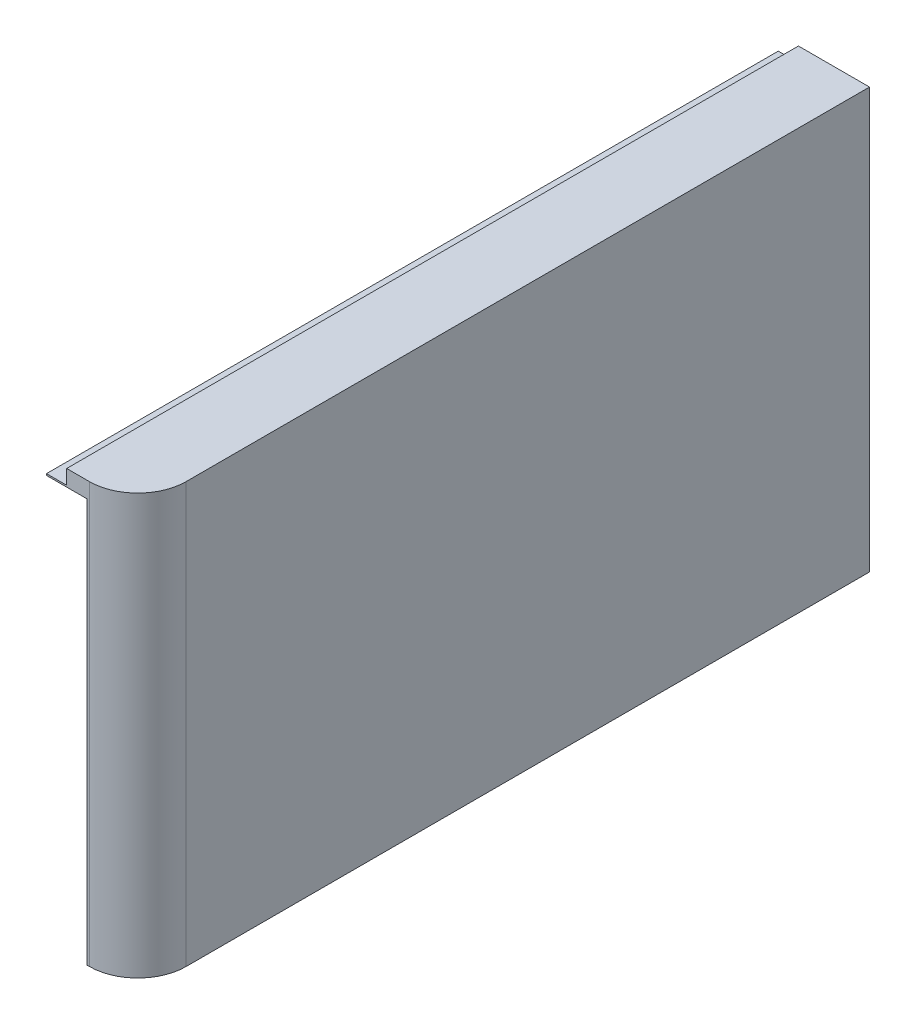
ISO-10303-21;
HEADER;
FILE_DESCRIPTION(('STEP AP214'),'2;1');
FILE_NAME('part.step','',(''),(''),'','','');
FILE_SCHEMA(('AUTOMOTIVE_DESIGN { 1 0 10303 214 1 1 1 1 }'));
ENDSEC;
DATA;
#1=APPLICATION_CONTEXT('core data for automotive mechanical design processes');
#2=APPLICATION_PROTOCOL_DEFINITION('international standard','automotive_design',2000,#1);
#3=PRODUCT_CONTEXT('',#1,'mechanical');
#4=PRODUCT('Part','Part','',(#3));
#5=PRODUCT_RELATED_PRODUCT_CATEGORY('part','',(#4));
#6=PRODUCT_DEFINITION_FORMATION('','',#4);
#7=PRODUCT_DEFINITION_CONTEXT('part definition',#1,'design');
#8=PRODUCT_DEFINITION('design','',#6,#7);
#9=PRODUCT_DEFINITION_SHAPE('','',#8);
#10=(LENGTH_UNIT() NAMED_UNIT(*) SI_UNIT(.MILLI.,.METRE.));
#11=(NAMED_UNIT(*) PLANE_ANGLE_UNIT() SI_UNIT($,.RADIAN.));
#12=(NAMED_UNIT(*) SI_UNIT($,.STERADIAN.) SOLID_ANGLE_UNIT());
#13=UNCERTAINTY_MEASURE_WITH_UNIT(LENGTH_MEASURE(1.E-05),#10,'distance_accuracy_value','');
#14=(GEOMETRIC_REPRESENTATION_CONTEXT(3) GLOBAL_UNCERTAINTY_ASSIGNED_CONTEXT((#13)) GLOBAL_UNIT_ASSIGNED_CONTEXT((#10,
#11,#12)) REPRESENTATION_CONTEXT('',''));
#15=CARTESIAN_POINT('',(0.,0.,0.));
#16=DIRECTION('',(0.,0.,1.));
#17=DIRECTION('',(1.,0.,0.));
#18=AXIS2_PLACEMENT_3D('',#15,#16,#17);
#19=CARTESIAN_POINT('',(664.,576.,1557.));
#20=DIRECTION('',(0.,1.,0.));
#21=DIRECTION('',(0.,0.,1.));
#22=AXIS2_PLACEMENT_3D('',#19,#20,#21);
#23=PLANE('',#22);
#24=DIRECTION('',(0.,0.,1.));
#25=VECTOR('',#24,1.);
#26=CARTESIAN_POINT('',(664.,576.,1104.));
#27=LINE('',#26,#25);
#28=CARTESIAN_POINT('',(664.,576.,1104.));
#29=VERTEX_POINT('',#28);
#30=CARTESIAN_POINT('',(664.,576.,2010.));
#31=VERTEX_POINT('',#30);
#32=EDGE_CURVE('E106',#29,#31,#27,.T.);
#33=ORIENTED_EDGE('',*,*,#32,.F.);
#34=DIRECTION('',(-1.,0.,0.));
#35=VECTOR('',#34,1.);
#36=CARTESIAN_POINT('',(727.,576.,1104.));
#37=LINE('',#36,#35);
#38=CARTESIAN_POINT('',(727.,576.,1104.));
#39=VERTEX_POINT('',#38);
#40=EDGE_CURVE('E36',#39,#29,#37,.T.);
#41=ORIENTED_EDGE('',*,*,#40,.F.);
#42=DIRECTION('',(0.,0.,-1.));
#43=VECTOR('',#42,1.);
#44=CARTESIAN_POINT('',(727.,576.,1950.));
#45=LINE('',#44,#43);
#46=CARTESIAN_POINT('',(727.,576.,1950.));
#47=VERTEX_POINT('',#46);
#48=EDGE_CURVE('E109',#47,#39,#45,.T.);
#49=ORIENTED_EDGE('',*,*,#48,.F.);
#50=CARTESIAN_POINT('',(667.,576.,1950.));
#51=DIRECTION('',(0.,1.,0.));
#52=DIRECTION('',(0.,0.,1.));
#53=AXIS2_PLACEMENT_3D('',#50,#51,#52);
#54=CIRCLE('',#53,60.);
#55=CARTESIAN_POINT('',(667.,576.,2010.));
#56=VERTEX_POINT('',#55);
#57=EDGE_CURVE('E125',#56,#47,#54,.T.);
#58=ORIENTED_EDGE('',*,*,#57,.F.);
#59=DIRECTION('',(1.,0.,0.));
#60=VECTOR('',#59,1.);
#61=CARTESIAN_POINT('',(664.,576.,2010.));
#62=LINE('',#61,#60);
#63=EDGE_CURVE('E11',#31,#56,#62,.T.);
#64=ORIENTED_EDGE('',*,*,#63,.F.);
#65=EDGE_LOOP('',(#33,#41,#49,#58,#64));
#66=FACE_BOUND('',#65,.T.);
#67=ADVANCED_FACE('F17',(#66),#23,.F.);
#68=CARTESIAN_POINT('',(664.,576.,2010.));
#69=DIRECTION('',(0.,0.,1.));
#70=DIRECTION('',(0.,1.,0.));
#71=AXIS2_PLACEMENT_3D('',#68,#69,#70);
#72=PLANE('',#71);
#73=ORIENTED_EDGE('',*,*,#63,.T.);
#74=DIRECTION('',(0.,1.,0.));
#75=VECTOR('',#74,1.);
#76=CARTESIAN_POINT('',(667.,576.,2010.));
#77=LINE('',#76,#75);
#78=CARTESIAN_POINT('',(667.,1096.,2010.));
#79=VERTEX_POINT('',#78);
#80=EDGE_CURVE('E27',#56,#79,#77,.T.);
#81=ORIENTED_EDGE('',*,*,#80,.T.);
#82=DIRECTION('',(-1.,0.,0.));
#83=VECTOR('',#82,1.);
#84=CARTESIAN_POINT('',(667.,1096.,2010.));
#85=LINE('',#84,#83);
#86=CARTESIAN_POINT('',(639.,1096.,2010.));
#87=VERTEX_POINT('',#86);
#88=EDGE_CURVE('E108',#79,#87,#85,.T.);
#89=ORIENTED_EDGE('',*,*,#88,.T.);
#90=DIRECTION('',(0.,1.,0.));
#91=VECTOR('',#90,1.);
#92=CARTESIAN_POINT('',(639.,1078.,2010.));
#93=LINE('',#92,#91);
#94=CARTESIAN_POINT('',(639.,1078.,2010.));
#95=VERTEX_POINT('',#94);
#96=EDGE_CURVE('E104',#95,#87,#93,.T.);
#97=ORIENTED_EDGE('',*,*,#96,.F.);
#98=DIRECTION('',(1.,0.,0.));
#99=VECTOR('',#98,1.);
#100=CARTESIAN_POINT('',(614.,1078.,2010.));
#101=LINE('',#100,#99);
#102=CARTESIAN_POINT('',(614.,1078.,2010.));
#103=VERTEX_POINT('',#102);
#104=EDGE_CURVE('E105',#103,#95,#101,.T.);
#105=ORIENTED_EDGE('',*,*,#104,.F.);
#106=DIRECTION('',(0.,1.,0.));
#107=VECTOR('',#106,1.);
#108=CARTESIAN_POINT('',(614.,1076.,2010.));
#109=LINE('',#108,#107);
#110=CARTESIAN_POINT('',(614.,1076.,2010.));
#111=VERTEX_POINT('',#110);
#112=EDGE_CURVE('E130',#111,#103,#109,.T.);
#113=ORIENTED_EDGE('',*,*,#112,.F.);
#114=DIRECTION('',(-1.,0.,0.));
#115=VECTOR('',#114,1.);
#116=CARTESIAN_POINT('',(664.,1076.,2010.));
#117=LINE('',#116,#115);
#118=CARTESIAN_POINT('',(664.,1076.,2010.));
#119=VERTEX_POINT('',#118);
#120=EDGE_CURVE('E85',#119,#111,#117,.T.);
#121=ORIENTED_EDGE('',*,*,#120,.F.);
#122=DIRECTION('',(0.,1.,0.));
#123=VECTOR('',#122,1.);
#124=CARTESIAN_POINT('',(664.,576.,2010.));
#125=LINE('',#124,#123);
#126=EDGE_CURVE('E82',#31,#119,#125,.T.);
#127=ORIENTED_EDGE('',*,*,#126,.F.);
#128=EDGE_LOOP('',(#73,#81,#89,#97,#105,#113,#121,#127));
#129=FACE_BOUND('',#128,.T.);
#130=ADVANCED_FACE('F155',(#129),#72,.T.);
#131=CARTESIAN_POINT('',(664.,576.,1104.));
#132=DIRECTION('',(-1.,0.,0.));
#133=DIRECTION('',(0.,0.,-1.));
#134=AXIS2_PLACEMENT_3D('',#131,#132,#133);
#135=PLANE('',#134);
#136=DIRECTION('',(0.,0.,1.));
#137=VECTOR('',#136,1.);
#138=CARTESIAN_POINT('',(664.,1076.,1104.));
#139=LINE('',#138,#137);
#140=CARTESIAN_POINT('',(664.,1076.,1104.));
#141=VERTEX_POINT('',#140);
#142=EDGE_CURVE('E79',#141,#119,#139,.T.);
#143=ORIENTED_EDGE('',*,*,#142,.F.);
#144=DIRECTION('',(0.,1.,0.));
#145=VECTOR('',#144,1.);
#146=CARTESIAN_POINT('',(664.,576.,1104.));
#147=LINE('',#146,#145);
#148=EDGE_CURVE('E80',#29,#141,#147,.T.);
#149=ORIENTED_EDGE('',*,*,#148,.F.);
#150=ORIENTED_EDGE('',*,*,#32,.T.);
#151=ORIENTED_EDGE('',*,*,#126,.T.);
#152=EDGE_LOOP('',(#143,#149,#150,#151));
#153=FACE_BOUND('',#152,.T.);
#154=ADVANCED_FACE('F19',(#153),#135,.T.);
#155=CARTESIAN_POINT('',(727.,576.,1104.));
#156=DIRECTION('',(0.,0.,-1.));
#157=DIRECTION('',(-1.,0.,0.));
#158=AXIS2_PLACEMENT_3D('',#155,#156,#157);
#159=PLANE('',#158);
#160=DIRECTION('',(0.,1.,0.));
#161=VECTOR('',#160,1.);
#162=CARTESIAN_POINT('',(727.,576.,1104.));
#163=LINE('',#162,#161);
#164=CARTESIAN_POINT('',(727.,1096.,1104.));
#165=VERTEX_POINT('',#164);
#166=EDGE_CURVE('E86',#39,#165,#163,.T.);
#167=ORIENTED_EDGE('',*,*,#166,.F.);
#168=ORIENTED_EDGE('',*,*,#40,.T.);
#169=ORIENTED_EDGE('',*,*,#148,.T.);
#170=DIRECTION('',(-1.,0.,0.));
#171=VECTOR('',#170,1.);
#172=CARTESIAN_POINT('',(664.,1076.,1104.));
#173=LINE('',#172,#171);
#174=CARTESIAN_POINT('',(614.,1076.,1104.));
#175=VERTEX_POINT('',#174);
#176=EDGE_CURVE('E91',#141,#175,#173,.T.);
#177=ORIENTED_EDGE('',*,*,#176,.T.);
#178=DIRECTION('',(0.,1.,0.));
#179=VECTOR('',#178,1.);
#180=CARTESIAN_POINT('',(614.,1076.,1104.));
#181=LINE('',#180,#179);
#182=CARTESIAN_POINT('',(614.,1078.,1104.));
#183=VERTEX_POINT('',#182);
#184=EDGE_CURVE('E97',#175,#183,#181,.T.);
#185=ORIENTED_EDGE('',*,*,#184,.T.);
#186=DIRECTION('',(1.,0.,0.));
#187=VECTOR('',#186,1.);
#188=CARTESIAN_POINT('',(614.,1078.,1104.));
#189=LINE('',#188,#187);
#190=CARTESIAN_POINT('',(639.,1078.,1104.));
#191=VERTEX_POINT('',#190);
#192=EDGE_CURVE('E21',#183,#191,#189,.T.);
#193=ORIENTED_EDGE('',*,*,#192,.T.);
#194=DIRECTION('',(0.,1.,0.));
#195=VECTOR('',#194,1.);
#196=CARTESIAN_POINT('',(639.,1078.,1104.));
#197=LINE('',#196,#195);
#198=CARTESIAN_POINT('',(639.,1096.,1104.));
#199=VERTEX_POINT('',#198);
#200=EDGE_CURVE('E115',#191,#199,#197,.T.);
#201=ORIENTED_EDGE('',*,*,#200,.T.);
#202=DIRECTION('',(1.,0.,0.));
#203=VECTOR('',#202,1.);
#204=CARTESIAN_POINT('',(639.,1096.,1104.));
#205=LINE('',#204,#203);
#206=EDGE_CURVE('E112',#199,#165,#205,.T.);
#207=ORIENTED_EDGE('',*,*,#206,.T.);
#208=EDGE_LOOP('',(#167,#168,#169,#177,#185,#193,#201,#207));
#209=FACE_BOUND('',#208,.T.);
#210=ADVANCED_FACE('F89',(#209),#159,.T.);
#211=CARTESIAN_POINT('',(664.,1096.,1557.));
#212=DIRECTION('',(0.,1.,0.));
#213=DIRECTION('',(0.,0.,1.));
#214=AXIS2_PLACEMENT_3D('',#211,#212,#213);
#215=PLANE('',#214);
#216=CARTESIAN_POINT('',(667.,1096.,1950.));
#217=DIRECTION('',(0.,1.,0.));
#218=DIRECTION('',(0.,0.,1.));
#219=AXIS2_PLACEMENT_3D('',#216,#217,#218);
#220=CIRCLE('',#219,60.);
#221=CARTESIAN_POINT('',(727.,1096.,1950.));
#222=VERTEX_POINT('',#221);
#223=EDGE_CURVE('E116',#79,#222,#220,.T.);
#224=ORIENTED_EDGE('',*,*,#223,.T.);
#225=DIRECTION('',(0.,0.,-1.));
#226=VECTOR('',#225,1.);
#227=CARTESIAN_POINT('',(727.,1096.,1950.));
#228=LINE('',#227,#226);
#229=EDGE_CURVE('E117',#222,#165,#228,.T.);
#230=ORIENTED_EDGE('',*,*,#229,.T.);
#231=ORIENTED_EDGE('',*,*,#206,.F.);
#232=DIRECTION('',(0.,0.,1.));
#233=VECTOR('',#232,1.);
#234=CARTESIAN_POINT('',(639.,1096.,1104.));
#235=LINE('',#234,#233);
#236=EDGE_CURVE('E120',#199,#87,#235,.T.);
#237=ORIENTED_EDGE('',*,*,#236,.T.);
#238=ORIENTED_EDGE('',*,*,#88,.F.);
#239=EDGE_LOOP('',(#224,#230,#231,#237,#238));
#240=FACE_BOUND('',#239,.T.);
#241=ADVANCED_FACE('F163',(#240),#215,.T.);
#242=CARTESIAN_POINT('',(639.,1078.,1104.));
#243=DIRECTION('',(-1.,0.,0.));
#244=DIRECTION('',(0.,0.,-1.));
#245=AXIS2_PLACEMENT_3D('',#242,#243,#244);
#246=PLANE('',#245);
#247=DIRECTION('',(0.,0.,1.));
#248=VECTOR('',#247,1.);
#249=CARTESIAN_POINT('',(639.,1078.,1104.));
#250=LINE('',#249,#248);
#251=EDGE_CURVE('E124',#191,#95,#250,.T.);
#252=ORIENTED_EDGE('',*,*,#251,.T.);
#253=ORIENTED_EDGE('',*,*,#96,.T.);
#254=ORIENTED_EDGE('',*,*,#236,.F.);
#255=ORIENTED_EDGE('',*,*,#200,.F.);
#256=EDGE_LOOP('',(#252,#253,#254,#255));
#257=FACE_BOUND('',#256,.T.);
#258=ADVANCED_FACE('F193',(#257),#246,.T.);
#259=CARTESIAN_POINT('',(614.,1078.,1104.));
#260=DIRECTION('',(0.,1.,0.));
#261=DIRECTION('',(0.,0.,1.));
#262=AXIS2_PLACEMENT_3D('',#259,#260,#261);
#263=PLANE('',#262);
#264=DIRECTION('',(0.,0.,1.));
#265=VECTOR('',#264,1.);
#266=CARTESIAN_POINT('',(614.,1078.,1104.));
#267=LINE('',#266,#265);
#268=EDGE_CURVE('E101',#183,#103,#267,.T.);
#269=ORIENTED_EDGE('',*,*,#268,.T.);
#270=ORIENTED_EDGE('',*,*,#104,.T.);
#271=ORIENTED_EDGE('',*,*,#251,.F.);
#272=ORIENTED_EDGE('',*,*,#192,.F.);
#273=EDGE_LOOP('',(#269,#270,#271,#272));
#274=FACE_BOUND('',#273,.T.);
#275=ADVANCED_FACE('F191',(#274),#263,.T.);
#276=CARTESIAN_POINT('',(614.,1076.,1104.));
#277=DIRECTION('',(-1.,0.,0.));
#278=DIRECTION('',(0.,0.,-1.));
#279=AXIS2_PLACEMENT_3D('',#276,#277,#278);
#280=PLANE('',#279);
#281=DIRECTION('',(0.,0.,1.));
#282=VECTOR('',#281,1.);
#283=CARTESIAN_POINT('',(614.,1076.,1104.));
#284=LINE('',#283,#282);
#285=EDGE_CURVE('E96',#175,#111,#284,.T.);
#286=ORIENTED_EDGE('',*,*,#285,.T.);
#287=ORIENTED_EDGE('',*,*,#112,.T.);
#288=ORIENTED_EDGE('',*,*,#268,.F.);
#289=ORIENTED_EDGE('',*,*,#184,.F.);
#290=EDGE_LOOP('',(#286,#287,#288,#289));
#291=FACE_BOUND('',#290,.T.);
#292=ADVANCED_FACE('F180',(#291),#280,.T.);
#293=CARTESIAN_POINT('',(664.,1076.,1104.));
#294=DIRECTION('',(0.,-1.,0.));
#295=DIRECTION('',(1.,0.,0.));
#296=AXIS2_PLACEMENT_3D('',#293,#294,#295);
#297=PLANE('',#296);
#298=ORIENTED_EDGE('',*,*,#120,.T.);
#299=ORIENTED_EDGE('',*,*,#285,.F.);
#300=ORIENTED_EDGE('',*,*,#176,.F.);
#301=ORIENTED_EDGE('',*,*,#142,.T.);
#302=EDGE_LOOP('',(#298,#299,#300,#301));
#303=FACE_BOUND('',#302,.T.);
#304=ADVANCED_FACE('F94',(#303),#297,.T.);
#305=CARTESIAN_POINT('',(727.,576.,1950.));
#306=DIRECTION('',(1.,0.,0.));
#307=DIRECTION('',(0.,1.,0.));
#308=AXIS2_PLACEMENT_3D('',#305,#306,#307);
#309=PLANE('',#308);
#310=ORIENTED_EDGE('',*,*,#166,.T.);
#311=ORIENTED_EDGE('',*,*,#229,.F.);
#312=DIRECTION('',(0.,1.,0.));
#313=VECTOR('',#312,1.);
#314=CARTESIAN_POINT('',(727.,576.,1950.));
#315=LINE('',#314,#313);
#316=EDGE_CURVE('E111',#47,#222,#315,.T.);
#317=ORIENTED_EDGE('',*,*,#316,.F.);
#318=ORIENTED_EDGE('',*,*,#48,.T.);
#319=EDGE_LOOP('',(#310,#311,#317,#318));
#320=FACE_BOUND('',#319,.T.);
#321=ADVANCED_FACE('F172',(#320),#309,.T.);
#322=CARTESIAN_POINT('',(667.,576.,1950.));
#323=DIRECTION('',(0.,1.,0.));
#324=DIRECTION('',(0.,0.,-1.));
#325=AXIS2_PLACEMENT_3D('',#322,#323,#324);
#326=CYLINDRICAL_SURFACE('',#325,60.);
#327=ORIENTED_EDGE('',*,*,#316,.T.);
#328=ORIENTED_EDGE('',*,*,#223,.F.);
#329=ORIENTED_EDGE('',*,*,#80,.F.);
#330=ORIENTED_EDGE('',*,*,#57,.T.);
#331=EDGE_LOOP('',(#327,#328,#329,#330));
#332=FACE_BOUND('',#331,.T.);
#333=ADVANCED_FACE('F159',(#332),#326,.T.);
#334=CLOSED_SHELL('',(#67,#130,#154,#210,#241,#258,#275,#292,#304,#321,#333));
#335=MANIFOLD_SOLID_BREP('B1',#334);
#336=ADVANCED_BREP_SHAPE_REPRESENTATION('',(#18,#335),#14);
#337=SHAPE_DEFINITION_REPRESENTATION(#9,#336);
ENDSEC;
END-ISO-10303-21;
